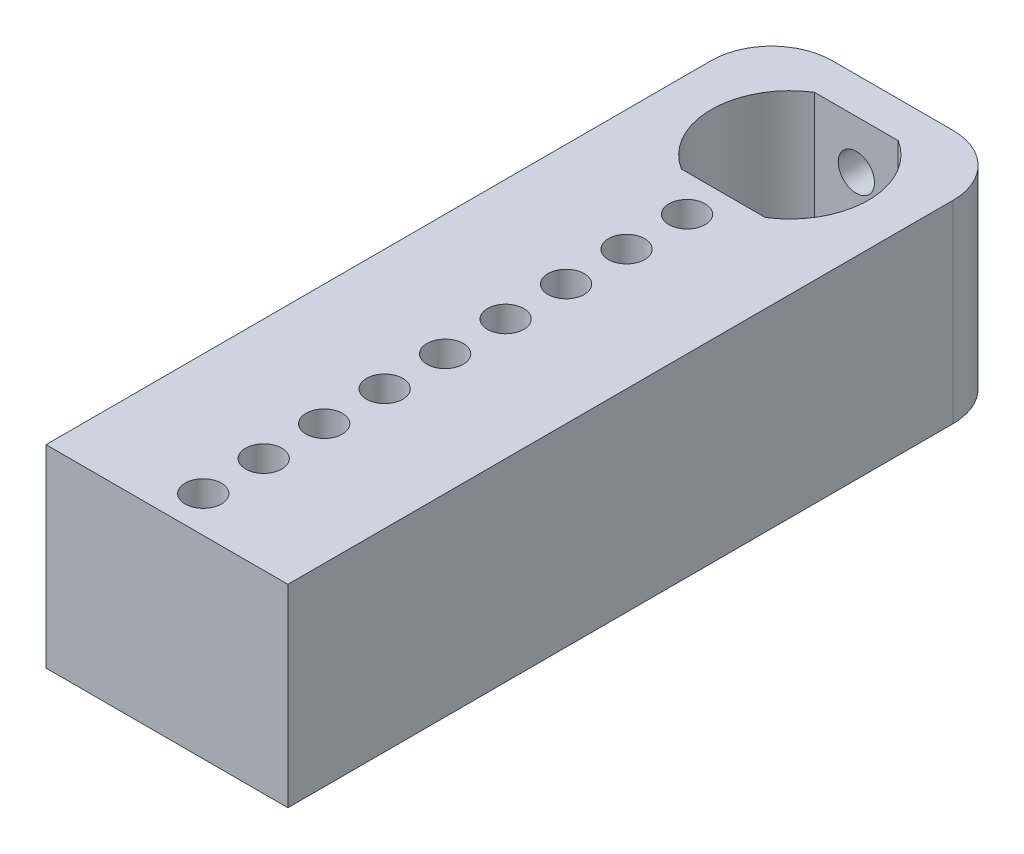
ISO-10303-21;
HEADER;
FILE_DESCRIPTION(('STEP AP214'),'2;1');
FILE_NAME('part.step','',(''),(''),'','','');
FILE_SCHEMA(('AUTOMOTIVE_DESIGN { 1 0 10303 214 1 1 1 1 }'));
ENDSEC;
DATA;
#1=APPLICATION_CONTEXT('core data for automotive mechanical design processes');
#2=APPLICATION_PROTOCOL_DEFINITION('international standard','automotive_design',2000,#1);
#3=PRODUCT_CONTEXT('',#1,'mechanical');
#4=PRODUCT('Part','Part','',(#3));
#5=PRODUCT_RELATED_PRODUCT_CATEGORY('part','',(#4));
#6=PRODUCT_DEFINITION_FORMATION('','',#4);
#7=PRODUCT_DEFINITION_CONTEXT('part definition',#1,'design');
#8=PRODUCT_DEFINITION('design','',#6,#7);
#9=PRODUCT_DEFINITION_SHAPE('','',#8);
#10=(LENGTH_UNIT() NAMED_UNIT(*) SI_UNIT(.MILLI.,.METRE.));
#11=(NAMED_UNIT(*) PLANE_ANGLE_UNIT() SI_UNIT($,.RADIAN.));
#12=(NAMED_UNIT(*) SI_UNIT($,.STERADIAN.) SOLID_ANGLE_UNIT());
#13=UNCERTAINTY_MEASURE_WITH_UNIT(LENGTH_MEASURE(1.E-05),#10,'distance_accuracy_value','');
#14=(GEOMETRIC_REPRESENTATION_CONTEXT(3) GLOBAL_UNCERTAINTY_ASSIGNED_CONTEXT((#13)) GLOBAL_UNIT_ASSIGNED_CONTEXT((#10,
#11,#12)) REPRESENTATION_CONTEXT('',''));
#15=CARTESIAN_POINT('',(0.,0.,0.));
#16=DIRECTION('',(0.,0.,1.));
#17=DIRECTION('',(1.,0.,0.));
#18=AXIS2_PLACEMENT_3D('',#15,#16,#17);
#19=CARTESIAN_POINT('',(10.,16.,30.));
#20=DIRECTION('',(-1.,0.,0.));
#21=DIRECTION('',(0.,0.,1.));
#22=AXIS2_PLACEMENT_3D('',#19,#20,#21);
#23=PLANE('',#22);
#24=DIRECTION('',(0.,0.,-1.));
#25=VECTOR('',#24,1.);
#26=CARTESIAN_POINT('',(10.,0.,30.));
#27=LINE('',#26,#25);
#28=CARTESIAN_POINT('',(10.,0.,30.));
#29=VERTEX_POINT('',#28);
#30=CARTESIAN_POINT('',(10.,0.,-25.));
#31=VERTEX_POINT('',#30);
#32=EDGE_CURVE('E160',#29,#31,#27,.T.);
#33=ORIENTED_EDGE('',*,*,#32,.T.);
#34=DIRECTION('',(0.,-1.,0.));
#35=VECTOR('',#34,1.);
#36=CARTESIAN_POINT('',(10.,16.,-25.));
#37=LINE('',#36,#35);
#38=CARTESIAN_POINT('',(10.,16.,-25.));
#39=VERTEX_POINT('',#38);
#40=EDGE_CURVE('E11',#31,#39,#37,.F.);
#41=ORIENTED_EDGE('',*,*,#40,.T.);
#42=DIRECTION('',(0.,0.,-1.));
#43=VECTOR('',#42,1.);
#44=CARTESIAN_POINT('',(10.,16.,30.));
#45=LINE('',#44,#43);
#46=CARTESIAN_POINT('',(10.,16.,30.));
#47=VERTEX_POINT('',#46);
#48=EDGE_CURVE('E164',#47,#39,#45,.T.);
#49=ORIENTED_EDGE('',*,*,#48,.F.);
#50=DIRECTION('',(0.,-1.,0.));
#51=VECTOR('',#50,1.);
#52=CARTESIAN_POINT('',(10.,16.,30.));
#53=LINE('',#52,#51);
#54=EDGE_CURVE('E173',#47,#29,#53,.T.);
#55=ORIENTED_EDGE('',*,*,#54,.T.);
#56=EDGE_LOOP('',(#33,#41,#49,#55));
#57=FACE_BOUND('',#56,.T.);
#58=ADVANCED_FACE('F37',(#57),#23,.F.);
#59=CARTESIAN_POINT('',(-10.,16.,-30.));
#60=DIRECTION('',(0.,0.,1.));
#61=DIRECTION('',(1.,0.,0.));
#62=AXIS2_PLACEMENT_3D('',#59,#60,#61);
#63=PLANE('',#62);
#64=CARTESIAN_POINT('',(0.,12.,-30.));
#65=DIRECTION('',(0.,0.,-1.));
#66=DIRECTION('',(-1.,0.,0.));
#67=AXIS2_PLACEMENT_3D('',#64,#65,#66);
#68=CIRCLE('',#67,1.5);
#69=CARTESIAN_POINT('',(-1.5,12.,-30.));
#70=VERTEX_POINT('',#69);
#71=EDGE_CURVE('E529',#70,#70,#68,.T.);
#72=ORIENTED_EDGE('',*,*,#71,.F.);
#73=EDGE_LOOP('',(#72));
#74=FACE_BOUND('',#73,.T.);
#75=CARTESIAN_POINT('',(0.,4.,-30.));
#76=DIRECTION('',(0.,0.,-1.));
#77=DIRECTION('',(-1.,0.,0.));
#78=AXIS2_PLACEMENT_3D('',#75,#76,#77);
#79=CIRCLE('',#78,1.5);
#80=CARTESIAN_POINT('',(-1.5,4.,-30.));
#81=VERTEX_POINT('',#80);
#82=EDGE_CURVE('E530',#81,#81,#79,.T.);
#83=ORIENTED_EDGE('',*,*,#82,.F.);
#84=EDGE_LOOP('',(#83));
#85=FACE_BOUND('',#84,.T.);
#86=DIRECTION('',(-1.,0.,0.));
#87=VECTOR('',#86,1.);
#88=CARTESIAN_POINT('',(-10.,0.,-30.));
#89=LINE('',#88,#87);
#90=CARTESIAN_POINT('',(5.,0.,-30.));
#91=VERTEX_POINT('',#90);
#92=CARTESIAN_POINT('',(-5.,0.,-30.));
#93=VERTEX_POINT('',#92);
#94=EDGE_CURVE('E175',#91,#93,#89,.T.);
#95=ORIENTED_EDGE('',*,*,#94,.T.);
#96=DIRECTION('',(0.,-1.,0.));
#97=VECTOR('',#96,1.);
#98=CARTESIAN_POINT('',(-5.,16.,-30.));
#99=LINE('',#98,#97);
#100=CARTESIAN_POINT('',(-5.,16.,-30.));
#101=VERTEX_POINT('',#100);
#102=EDGE_CURVE('E58',#93,#101,#99,.F.);
#103=ORIENTED_EDGE('',*,*,#102,.T.);
#104=DIRECTION('',(-1.,0.,0.));
#105=VECTOR('',#104,1.);
#106=CARTESIAN_POINT('',(-10.,16.,-30.));
#107=LINE('',#106,#105);
#108=CARTESIAN_POINT('',(5.,16.,-30.));
#109=VERTEX_POINT('',#108);
#110=EDGE_CURVE('E166',#109,#101,#107,.T.);
#111=ORIENTED_EDGE('',*,*,#110,.F.);
#112=DIRECTION('',(0.,-1.,0.));
#113=VECTOR('',#112,1.);
#114=CARTESIAN_POINT('',(5.,16.,-30.));
#115=LINE('',#114,#113);
#116=EDGE_CURVE('E192',#109,#91,#115,.T.);
#117=ORIENTED_EDGE('',*,*,#116,.T.);
#118=EDGE_LOOP('',(#95,#103,#111,#117));
#119=FACE_BOUND('',#118,.T.);
#120=ADVANCED_FACE('F211',(#74,#85,#119),#63,.F.);
#121=CARTESIAN_POINT('',(-10.,16.,30.));
#122=DIRECTION('',(1.,0.,0.));
#123=DIRECTION('',(0.,0.,-1.));
#124=AXIS2_PLACEMENT_3D('',#121,#122,#123);
#125=PLANE('',#124);
#126=DIRECTION('',(0.,0.,1.));
#127=VECTOR('',#126,1.);
#128=CARTESIAN_POINT('',(-10.,16.,30.));
#129=LINE('',#128,#127);
#130=CARTESIAN_POINT('',(-10.,16.,-25.));
#131=VERTEX_POINT('',#130);
#132=CARTESIAN_POINT('',(-10.,16.,30.));
#133=VERTEX_POINT('',#132);
#134=EDGE_CURVE('E169',#131,#133,#129,.T.);
#135=ORIENTED_EDGE('',*,*,#134,.F.);
#136=DIRECTION('',(0.,-1.,0.));
#137=VECTOR('',#136,1.);
#138=CARTESIAN_POINT('',(-10.,16.,-25.));
#139=LINE('',#138,#137);
#140=CARTESIAN_POINT('',(-10.,0.,-25.));
#141=VERTEX_POINT('',#140);
#142=EDGE_CURVE('E185',#131,#141,#139,.T.);
#143=ORIENTED_EDGE('',*,*,#142,.T.);
#144=DIRECTION('',(0.,0.,1.));
#145=VECTOR('',#144,1.);
#146=CARTESIAN_POINT('',(-10.,0.,30.));
#147=LINE('',#146,#145);
#148=CARTESIAN_POINT('',(-10.,0.,30.));
#149=VERTEX_POINT('',#148);
#150=EDGE_CURVE('E177',#141,#149,#147,.T.);
#151=ORIENTED_EDGE('',*,*,#150,.T.);
#152=DIRECTION('',(0.,-1.,0.));
#153=VECTOR('',#152,1.);
#154=CARTESIAN_POINT('',(-10.,16.,30.));
#155=LINE('',#154,#153);
#156=EDGE_CURVE('E182',#133,#149,#155,.T.);
#157=ORIENTED_EDGE('',*,*,#156,.F.);
#158=EDGE_LOOP('',(#135,#143,#151,#157));
#159=FACE_BOUND('',#158,.T.);
#160=ADVANCED_FACE('F205',(#159),#125,.F.);
#161=CARTESIAN_POINT('',(-10.,16.,30.));
#162=DIRECTION('',(0.,0.,-1.));
#163=DIRECTION('',(-1.,0.,0.));
#164=AXIS2_PLACEMENT_3D('',#161,#162,#163);
#165=PLANE('',#164);
#166=DIRECTION('',(1.,0.,0.));
#167=VECTOR('',#166,1.);
#168=CARTESIAN_POINT('',(-10.,0.,30.));
#169=LINE('',#168,#167);
#170=EDGE_CURVE('E167',#149,#29,#169,.T.);
#171=ORIENTED_EDGE('',*,*,#170,.T.);
#172=ORIENTED_EDGE('',*,*,#54,.F.);
#173=DIRECTION('',(1.,0.,0.));
#174=VECTOR('',#173,1.);
#175=CARTESIAN_POINT('',(-10.,16.,30.));
#176=LINE('',#175,#174);
#177=EDGE_CURVE('E171',#133,#47,#176,.T.);
#178=ORIENTED_EDGE('',*,*,#177,.F.);
#179=ORIENTED_EDGE('',*,*,#156,.T.);
#180=EDGE_LOOP('',(#171,#172,#178,#179));
#181=FACE_BOUND('',#180,.T.);
#182=ADVANCED_FACE('F218',(#181),#165,.F.);
#183=CARTESIAN_POINT('',(0.,16.,0.));
#184=DIRECTION('',(0.,-1.,0.));
#185=DIRECTION('',(0.,0.,-1.));
#186=AXIS2_PLACEMENT_3D('',#183,#184,#185);
#187=PLANE('',#186);
#188=CARTESIAN_POINT('',(-1.68816679534573E-13,16.,-13.));
#189=DIRECTION('',(0.,1.,0.));
#190=DIRECTION('',(0.,0.,1.));
#191=AXIS2_PLACEMENT_3D('',#188,#189,#190);
#192=CIRCLE('',#191,1.5);
#193=CARTESIAN_POINT('',(-1.68816679534573E-13,16.,-11.5));
#194=VERTEX_POINT('',#193);
#195=EDGE_CURVE('E537',#194,#194,#192,.T.);
#196=ORIENTED_EDGE('',*,*,#195,.F.);
#197=EDGE_LOOP('',(#196));
#198=FACE_BOUND('',#197,.T.);
#199=CARTESIAN_POINT('',(-1.16750621151713E-13,16.,-8.00000000000001));
#200=DIRECTION('',(0.,1.,0.));
#201=DIRECTION('',(0.,0.,1.));
#202=AXIS2_PLACEMENT_3D('',#199,#200,#201);
#203=CIRCLE('',#202,1.5);
#204=CARTESIAN_POINT('',(-1.16750621151713E-13,16.,-6.50000000000001));
#205=VERTEX_POINT('',#204);
#206=EDGE_CURVE('E583',#205,#205,#203,.T.);
#207=ORIENTED_EDGE('',*,*,#206,.F.);
#208=EDGE_LOOP('',(#207));
#209=FACE_BOUND('',#208,.T.);
#210=CARTESIAN_POINT('',(0.,16.,-3.00000000000001));
#211=DIRECTION('',(0.,1.,0.));
#212=DIRECTION('',(0.,0.,1.));
#213=AXIS2_PLACEMENT_3D('',#210,#211,#212);
#214=CIRCLE('',#213,1.5);
#215=CARTESIAN_POINT('',(0.,16.,-1.50000000000001));
#216=VERTEX_POINT('',#215);
#217=EDGE_CURVE('E577',#216,#216,#214,.T.);
#218=ORIENTED_EDGE('',*,*,#217,.F.);
#219=EDGE_LOOP('',(#218));
#220=FACE_BOUND('',#219,.T.);
#221=CARTESIAN_POINT('',(0.,16.,1.99999999999999));
#222=DIRECTION('',(0.,1.,0.));
#223=DIRECTION('',(0.,0.,1.));
#224=AXIS2_PLACEMENT_3D('',#221,#222,#223);
#225=CIRCLE('',#224,1.5);
#226=CARTESIAN_POINT('',(0.,16.,3.49999999999999));
#227=VERTEX_POINT('',#226);
#228=EDGE_CURVE('E571',#227,#227,#225,.T.);
#229=ORIENTED_EDGE('',*,*,#228,.F.);
#230=EDGE_LOOP('',(#229));
#231=FACE_BOUND('',#230,.T.);
#232=CARTESIAN_POINT('',(0.,16.,6.99999999999999));
#233=DIRECTION('',(0.,1.,0.));
#234=DIRECTION('',(0.,0.,1.));
#235=AXIS2_PLACEMENT_3D('',#232,#233,#234);
#236=CIRCLE('',#235,1.5);
#237=CARTESIAN_POINT('',(0.,16.,8.49999999999999));
#238=VERTEX_POINT('',#237);
#239=EDGE_CURVE('E565',#238,#238,#236,.T.);
#240=ORIENTED_EDGE('',*,*,#239,.F.);
#241=EDGE_LOOP('',(#240));
#242=FACE_BOUND('',#241,.T.);
#243=CARTESIAN_POINT('',(0.,16.,12.));
#244=DIRECTION('',(0.,1.,0.));
#245=DIRECTION('',(0.,0.,1.));
#246=AXIS2_PLACEMENT_3D('',#243,#244,#245);
#247=CIRCLE('',#246,1.5);
#248=CARTESIAN_POINT('',(0.,16.,13.5));
#249=VERTEX_POINT('',#248);
#250=EDGE_CURVE('E559',#249,#249,#247,.T.);
#251=ORIENTED_EDGE('',*,*,#250,.F.);
#252=EDGE_LOOP('',(#251));
#253=FACE_BOUND('',#252,.T.);
#254=CARTESIAN_POINT('',(1.43579670762588E-13,16.,17.));
#255=DIRECTION('',(0.,1.,0.));
#256=DIRECTION('',(0.,0.,1.));
#257=AXIS2_PLACEMENT_3D('',#254,#255,#256);
#258=CIRCLE('',#257,1.5);
#259=CARTESIAN_POINT('',(1.43579670762588E-13,16.,18.5));
#260=VERTEX_POINT('',#259);
#261=EDGE_CURVE('E553',#260,#260,#258,.T.);
#262=ORIENTED_EDGE('',*,*,#261,.F.);
#263=EDGE_LOOP('',(#262));
#264=FACE_BOUND('',#263,.T.);
#265=CARTESIAN_POINT('',(1.95645729145448E-13,16.,22.));
#266=DIRECTION('',(0.,1.,0.));
#267=DIRECTION('',(0.,0.,1.));
#268=AXIS2_PLACEMENT_3D('',#265,#266,#267);
#269=CIRCLE('',#268,1.5);
#270=CARTESIAN_POINT('',(1.95645729145448E-13,16.,23.5));
#271=VERTEX_POINT('',#270);
#272=EDGE_CURVE('E547',#271,#271,#269,.T.);
#273=ORIENTED_EDGE('',*,*,#272,.F.);
#274=EDGE_LOOP('',(#273));
#275=FACE_BOUND('',#274,.T.);
#276=CARTESIAN_POINT('',(2.47711787528309E-13,16.,27.));
#277=DIRECTION('',(0.,1.,0.));
#278=DIRECTION('',(0.,0.,1.));
#279=AXIS2_PLACEMENT_3D('',#276,#277,#278);
#280=CIRCLE('',#279,1.5);
#281=CARTESIAN_POINT('',(2.47711787528309E-13,16.,28.5));
#282=VERTEX_POINT('',#281);
#283=EDGE_CURVE('E541',#282,#282,#280,.T.);
#284=ORIENTED_EDGE('',*,*,#283,.F.);
#285=EDGE_LOOP('',(#284));
#286=FACE_BOUND('',#285,.T.);
#287=DIRECTION('',(1.,0.,0.));
#288=VECTOR('',#287,1.);
#289=CARTESIAN_POINT('',(-3.46410161513776,16.,-16.));
#290=LINE('',#289,#288);
#291=CARTESIAN_POINT('',(-3.46410161513776,16.,-16.));
#292=VERTEX_POINT('',#291);
#293=CARTESIAN_POINT('',(3.46410161513776,16.,-16.));
#294=VERTEX_POINT('',#293);
#295=EDGE_CURVE('E153',#292,#294,#290,.T.);
#296=ORIENTED_EDGE('',*,*,#295,.F.);
#297=CARTESIAN_POINT('',(0.,16.,-21.5));
#298=DIRECTION('',(0.,1.,0.));
#299=DIRECTION('',(0.,0.,1.));
#300=AXIS2_PLACEMENT_3D('',#297,#298,#299);
#301=CIRCLE('',#300,6.5);
#302=CARTESIAN_POINT('',(-3.46410161513776,16.,-27.));
#303=VERTEX_POINT('',#302);
#304=EDGE_CURVE('E123',#303,#292,#301,.T.);
#305=ORIENTED_EDGE('',*,*,#304,.F.);
#306=DIRECTION('',(-1.,0.,0.));
#307=VECTOR('',#306,1.);
#308=CARTESIAN_POINT('',(-3.46410161513776,16.,-27.));
#309=LINE('',#308,#307);
#310=CARTESIAN_POINT('',(3.46410161513776,16.,-27.));
#311=VERTEX_POINT('',#310);
#312=EDGE_CURVE('E141',#311,#303,#309,.T.);
#313=ORIENTED_EDGE('',*,*,#312,.F.);
#314=CARTESIAN_POINT('',(0.,16.,-21.5));
#315=DIRECTION('',(0.,1.,0.));
#316=DIRECTION('',(0.,0.,1.));
#317=AXIS2_PLACEMENT_3D('',#314,#315,#316);
#318=CIRCLE('',#317,6.5);
#319=EDGE_CURVE('E144',#294,#311,#318,.T.);
#320=ORIENTED_EDGE('',*,*,#319,.F.);
#321=EDGE_LOOP('',(#296,#305,#313,#320));
#322=FACE_BOUND('',#321,.T.);
#323=ORIENTED_EDGE('',*,*,#110,.T.);
#324=CARTESIAN_POINT('',(-5.,16.,-25.));
#325=DIRECTION('',(0.,-1.,0.));
#326=DIRECTION('',(0.,0.,-1.));
#327=AXIS2_PLACEMENT_3D('',#324,#325,#326);
#328=CIRCLE('',#327,5.);
#329=EDGE_CURVE('E45',#101,#131,#328,.F.);
#330=ORIENTED_EDGE('',*,*,#329,.T.);
#331=ORIENTED_EDGE('',*,*,#134,.T.);
#332=ORIENTED_EDGE('',*,*,#177,.T.);
#333=ORIENTED_EDGE('',*,*,#48,.T.);
#334=CARTESIAN_POINT('',(5.,16.,-25.));
#335=DIRECTION('',(0.,-1.,0.));
#336=DIRECTION('',(0.,0.,-1.));
#337=AXIS2_PLACEMENT_3D('',#334,#335,#336);
#338=CIRCLE('',#337,5.);
#339=EDGE_CURVE('E196',#39,#109,#338,.F.);
#340=ORIENTED_EDGE('',*,*,#339,.T.);
#341=EDGE_LOOP('',(#323,#330,#331,#332,#333,#340));
#342=FACE_BOUND('',#341,.T.);
#343=ADVANCED_FACE('F200',(#198,#209,#220,#231,#242,#253,#264,#275,#286,#322,#342),#187,.F.);
#344=CARTESIAN_POINT('',(0.,0.,0.));
#345=DIRECTION('',(0.,-1.,0.));
#346=DIRECTION('',(0.,0.,-1.));
#347=AXIS2_PLACEMENT_3D('',#344,#345,#346);
#348=PLANE('',#347);
#349=CARTESIAN_POINT('',(0.,0.,-21.5));
#350=DIRECTION('',(0.,1.,0.));
#351=DIRECTION('',(0.,0.,1.));
#352=AXIS2_PLACEMENT_3D('',#349,#350,#351);
#353=CIRCLE('',#352,6.5);
#354=CARTESIAN_POINT('',(-3.46410161513776,0.,-27.));
#355=VERTEX_POINT('',#354);
#356=CARTESIAN_POINT('',(-3.46410161513776,0.,-16.));
#357=VERTEX_POINT('',#356);
#358=EDGE_CURVE('E120',#355,#357,#353,.T.);
#359=ORIENTED_EDGE('',*,*,#358,.T.);
#360=DIRECTION('',(1.,0.,0.));
#361=VECTOR('',#360,1.);
#362=CARTESIAN_POINT('',(-3.46410161513776,0.,-16.));
#363=LINE('',#362,#361);
#364=CARTESIAN_POINT('',(3.46410161513776,0.,-16.));
#365=VERTEX_POINT('',#364);
#366=EDGE_CURVE('E132',#357,#365,#363,.T.);
#367=ORIENTED_EDGE('',*,*,#366,.T.);
#368=CARTESIAN_POINT('',(0.,0.,-21.5));
#369=DIRECTION('',(0.,1.,0.));
#370=DIRECTION('',(0.,0.,1.));
#371=AXIS2_PLACEMENT_3D('',#368,#369,#370);
#372=CIRCLE('',#371,6.5);
#373=CARTESIAN_POINT('',(3.46410161513776,0.,-27.));
#374=VERTEX_POINT('',#373);
#375=EDGE_CURVE('E136',#365,#374,#372,.T.);
#376=ORIENTED_EDGE('',*,*,#375,.T.);
#377=DIRECTION('',(-1.,0.,0.));
#378=VECTOR('',#377,1.);
#379=CARTESIAN_POINT('',(-3.46410161513776,0.,-27.));
#380=LINE('',#379,#378);
#381=EDGE_CURVE('E128',#374,#355,#380,.T.);
#382=ORIENTED_EDGE('',*,*,#381,.T.);
#383=EDGE_LOOP('',(#359,#367,#376,#382));
#384=FACE_BOUND('',#383,.T.);
#385=ORIENTED_EDGE('',*,*,#150,.F.);
#386=CARTESIAN_POINT('',(-5.,0.,-25.));
#387=DIRECTION('',(0.,-1.,0.));
#388=DIRECTION('',(0.,0.,-1.));
#389=AXIS2_PLACEMENT_3D('',#386,#387,#388);
#390=CIRCLE('',#389,5.);
#391=EDGE_CURVE('E190',#141,#93,#390,.T.);
#392=ORIENTED_EDGE('',*,*,#391,.T.);
#393=ORIENTED_EDGE('',*,*,#94,.F.);
#394=CARTESIAN_POINT('',(5.,0.,-25.));
#395=DIRECTION('',(0.,-1.,0.));
#396=DIRECTION('',(0.,0.,-1.));
#397=AXIS2_PLACEMENT_3D('',#394,#395,#396);
#398=CIRCLE('',#397,5.);
#399=EDGE_CURVE('E188',#91,#31,#398,.T.);
#400=ORIENTED_EDGE('',*,*,#399,.T.);
#401=ORIENTED_EDGE('',*,*,#32,.F.);
#402=ORIENTED_EDGE('',*,*,#170,.F.);
#403=EDGE_LOOP('',(#385,#392,#393,#400,#401,#402));
#404=FACE_BOUND('',#403,.T.);
#405=ADVANCED_FACE('F138',(#384,#404),#348,.T.);
#406=CARTESIAN_POINT('',(0.,0.,-21.5));
#407=DIRECTION('',(0.,1.,0.));
#408=DIRECTION('',(0.,0.,1.));
#409=AXIS2_PLACEMENT_3D('',#406,#407,#408);
#410=CYLINDRICAL_SURFACE('',#409,6.5);
#411=ORIENTED_EDGE('',*,*,#304,.T.);
#412=DIRECTION('',(0.,1.,0.));
#413=VECTOR('',#412,1.);
#414=CARTESIAN_POINT('',(-3.46410161513776,0.,-16.));
#415=LINE('',#414,#413);
#416=EDGE_CURVE('E116',#357,#292,#415,.T.);
#417=ORIENTED_EDGE('',*,*,#416,.F.);
#418=ORIENTED_EDGE('',*,*,#358,.F.);
#419=DIRECTION('',(0.,1.,0.));
#420=VECTOR('',#419,1.);
#421=CARTESIAN_POINT('',(-3.46410161513776,0.,-27.));
#422=LINE('',#421,#420);
#423=EDGE_CURVE('E158',#355,#303,#422,.T.);
#424=ORIENTED_EDGE('',*,*,#423,.T.);
#425=EDGE_LOOP('',(#411,#417,#418,#424));
#426=FACE_BOUND('',#425,.T.);
#427=ADVANCED_FACE('F118',(#426),#410,.F.);
#428=CARTESIAN_POINT('',(-3.46410161513776,0.,-27.));
#429=DIRECTION('',(0.,0.,-1.));
#430=DIRECTION('',(-1.,0.,0.));
#431=AXIS2_PLACEMENT_3D('',#428,#429,#430);
#432=PLANE('',#431);
#433=CARTESIAN_POINT('',(0.,12.,-27.));
#434=DIRECTION('',(0.,0.,-1.));
#435=DIRECTION('',(-1.,0.,0.));
#436=AXIS2_PLACEMENT_3D('',#433,#434,#435);
#437=CIRCLE('',#436,1.5);
#438=CARTESIAN_POINT('',(-1.5,12.,-27.));
#439=VERTEX_POINT('',#438);
#440=EDGE_CURVE('E154',#439,#439,#437,.F.);
#441=ORIENTED_EDGE('',*,*,#440,.F.);
#442=EDGE_LOOP('',(#441));
#443=FACE_BOUND('',#442,.T.);
#444=CARTESIAN_POINT('',(0.,4.,-27.));
#445=DIRECTION('',(0.,0.,-1.));
#446=DIRECTION('',(-1.,0.,0.));
#447=AXIS2_PLACEMENT_3D('',#444,#445,#446);
#448=CIRCLE('',#447,1.5);
#449=CARTESIAN_POINT('',(-1.5,4.,-27.));
#450=VERTEX_POINT('',#449);
#451=EDGE_CURVE('E147',#450,#450,#448,.F.);
#452=ORIENTED_EDGE('',*,*,#451,.F.);
#453=EDGE_LOOP('',(#452));
#454=FACE_BOUND('',#453,.T.);
#455=ORIENTED_EDGE('',*,*,#312,.T.);
#456=ORIENTED_EDGE('',*,*,#423,.F.);
#457=ORIENTED_EDGE('',*,*,#381,.F.);
#458=DIRECTION('',(0.,1.,0.));
#459=VECTOR('',#458,1.);
#460=CARTESIAN_POINT('',(3.46410161513776,0.,-27.));
#461=LINE('',#460,#459);
#462=EDGE_CURVE('E161',#374,#311,#461,.T.);
#463=ORIENTED_EDGE('',*,*,#462,.T.);
#464=EDGE_LOOP('',(#455,#456,#457,#463));
#465=FACE_BOUND('',#464,.T.);
#466=ADVANCED_FACE('F324',(#443,#454,#465),#432,.F.);
#467=CARTESIAN_POINT('',(0.,0.,-21.5));
#468=DIRECTION('',(0.,1.,0.));
#469=DIRECTION('',(0.,0.,1.));
#470=AXIS2_PLACEMENT_3D('',#467,#468,#469);
#471=CYLINDRICAL_SURFACE('',#470,6.5);
#472=ORIENTED_EDGE('',*,*,#319,.T.);
#473=ORIENTED_EDGE('',*,*,#462,.F.);
#474=ORIENTED_EDGE('',*,*,#375,.F.);
#475=DIRECTION('',(0.,1.,0.));
#476=VECTOR('',#475,1.);
#477=CARTESIAN_POINT('',(3.46410161513776,0.,-16.));
#478=LINE('',#477,#476);
#479=EDGE_CURVE('E127',#365,#294,#478,.T.);
#480=ORIENTED_EDGE('',*,*,#479,.T.);
#481=EDGE_LOOP('',(#472,#473,#474,#480));
#482=FACE_BOUND('',#481,.T.);
#483=ADVANCED_FACE('F327',(#482),#471,.F.);
#484=CARTESIAN_POINT('',(-3.46410161513776,0.,-16.));
#485=DIRECTION('',(0.,0.,1.));
#486=DIRECTION('',(1.,0.,0.));
#487=AXIS2_PLACEMENT_3D('',#484,#485,#486);
#488=PLANE('',#487);
#489=ORIENTED_EDGE('',*,*,#295,.T.);
#490=ORIENTED_EDGE('',*,*,#479,.F.);
#491=ORIENTED_EDGE('',*,*,#366,.F.);
#492=ORIENTED_EDGE('',*,*,#416,.T.);
#493=EDGE_LOOP('',(#489,#490,#491,#492));
#494=FACE_BOUND('',#493,.T.);
#495=ADVANCED_FACE('F133',(#494),#488,.F.);
#496=CARTESIAN_POINT('',(0.,4.,-22.7573593128807));
#497=DIRECTION('',(0.,0.,-1.));
#498=DIRECTION('',(-1.,0.,0.));
#499=AXIS2_PLACEMENT_3D('',#496,#497,#498);
#500=CYLINDRICAL_SURFACE('',#499,1.5);
#501=ORIENTED_EDGE('',*,*,#451,.T.);
#502=EDGE_LOOP('',(#501));
#503=FACE_BOUND('',#502,.T.);
#504=ORIENTED_EDGE('',*,*,#82,.T.);
#505=EDGE_LOOP('',(#504));
#506=FACE_BOUND('',#505,.T.);
#507=ADVANCED_FACE('F319',(#503,#506),#500,.F.);
#508=CARTESIAN_POINT('',(0.,12.,-22.7573593128807));
#509=DIRECTION('',(0.,0.,-1.));
#510=DIRECTION('',(-1.,0.,0.));
#511=AXIS2_PLACEMENT_3D('',#508,#509,#510);
#512=CYLINDRICAL_SURFACE('',#511,1.5);
#513=ORIENTED_EDGE('',*,*,#440,.T.);
#514=EDGE_LOOP('',(#513));
#515=FACE_BOUND('',#514,.T.);
#516=ORIENTED_EDGE('',*,*,#71,.T.);
#517=EDGE_LOOP('',(#516));
#518=FACE_BOUND('',#517,.T.);
#519=ADVANCED_FACE('F315',(#515,#518),#512,.F.);
#520=CARTESIAN_POINT('',(2.47711787528309E-13,8.,27.));
#521=DIRECTION('',(0.,1.,0.));
#522=DIRECTION('',(0.,0.,1.));
#523=AXIS2_PLACEMENT_3D('',#520,#521,#522);
#524=CYLINDRICAL_SURFACE('',#523,1.5);
#525=CARTESIAN_POINT('',(2.47711787528309E-13,8.,27.));
#526=DIRECTION('',(0.,1.,0.));
#527=DIRECTION('',(0.,0.,1.));
#528=AXIS2_PLACEMENT_3D('',#525,#526,#527);
#529=CIRCLE('',#528,1.5);
#530=CARTESIAN_POINT('',(2.47711787528309E-13,8.,28.5));
#531=VERTEX_POINT('',#530);
#532=EDGE_CURVE('E544',#531,#531,#529,.T.);
#533=ORIENTED_EDGE('',*,*,#532,.F.);
#534=EDGE_LOOP('',(#533));
#535=FACE_BOUND('',#534,.T.);
#536=ORIENTED_EDGE('',*,*,#283,.T.);
#537=EDGE_LOOP('',(#536));
#538=FACE_BOUND('',#537,.T.);
#539=ADVANCED_FACE('F311',(#535,#538),#524,.F.);
#540=CARTESIAN_POINT('',(2.47711787528309E-13,8.,27.));
#541=DIRECTION('',(0.,1.,0.));
#542=DIRECTION('',(0.,0.,1.));
#543=AXIS2_PLACEMENT_3D('',#540,#541,#542);
#544=PLANE('',#543);
#545=ORIENTED_EDGE('',*,*,#532,.T.);
#546=EDGE_LOOP('',(#545));
#547=FACE_BOUND('',#546,.T.);
#548=ADVANCED_FACE('F307',(#547),#544,.T.);
#549=CARTESIAN_POINT('',(1.95645729145448E-13,8.,22.));
#550=DIRECTION('',(0.,1.,0.));
#551=DIRECTION('',(0.,0.,1.));
#552=AXIS2_PLACEMENT_3D('',#549,#550,#551);
#553=CYLINDRICAL_SURFACE('',#552,1.5);
#554=CARTESIAN_POINT('',(1.95645729145448E-13,8.,22.));
#555=DIRECTION('',(0.,1.,0.));
#556=DIRECTION('',(0.,0.,1.));
#557=AXIS2_PLACEMENT_3D('',#554,#555,#556);
#558=CIRCLE('',#557,1.5);
#559=CARTESIAN_POINT('',(1.95645729145448E-13,8.,23.5));
#560=VERTEX_POINT('',#559);
#561=EDGE_CURVE('E550',#560,#560,#558,.T.);
#562=ORIENTED_EDGE('',*,*,#561,.F.);
#563=EDGE_LOOP('',(#562));
#564=FACE_BOUND('',#563,.T.);
#565=ORIENTED_EDGE('',*,*,#272,.T.);
#566=EDGE_LOOP('',(#565));
#567=FACE_BOUND('',#566,.T.);
#568=ADVANCED_FACE('F303',(#564,#567),#553,.F.);
#569=CARTESIAN_POINT('',(1.95645729145448E-13,8.,22.));
#570=DIRECTION('',(0.,1.,0.));
#571=DIRECTION('',(0.,0.,1.));
#572=AXIS2_PLACEMENT_3D('',#569,#570,#571);
#573=PLANE('',#572);
#574=ORIENTED_EDGE('',*,*,#561,.T.);
#575=EDGE_LOOP('',(#574));
#576=FACE_BOUND('',#575,.T.);
#577=ADVANCED_FACE('F299',(#576),#573,.T.);
#578=CARTESIAN_POINT('',(1.43579670762588E-13,8.,17.));
#579=DIRECTION('',(0.,1.,0.));
#580=DIRECTION('',(0.,0.,1.));
#581=AXIS2_PLACEMENT_3D('',#578,#579,#580);
#582=CYLINDRICAL_SURFACE('',#581,1.5);
#583=CARTESIAN_POINT('',(1.43579670762588E-13,8.,17.));
#584=DIRECTION('',(0.,1.,0.));
#585=DIRECTION('',(0.,0.,1.));
#586=AXIS2_PLACEMENT_3D('',#583,#584,#585);
#587=CIRCLE('',#586,1.5);
#588=CARTESIAN_POINT('',(1.43579670762588E-13,8.,18.5));
#589=VERTEX_POINT('',#588);
#590=EDGE_CURVE('E556',#589,#589,#587,.T.);
#591=ORIENTED_EDGE('',*,*,#590,.F.);
#592=EDGE_LOOP('',(#591));
#593=FACE_BOUND('',#592,.T.);
#594=ORIENTED_EDGE('',*,*,#261,.T.);
#595=EDGE_LOOP('',(#594));
#596=FACE_BOUND('',#595,.T.);
#597=ADVANCED_FACE('F295',(#593,#596),#582,.F.);
#598=CARTESIAN_POINT('',(1.43579670762588E-13,8.,17.));
#599=DIRECTION('',(0.,1.,0.));
#600=DIRECTION('',(0.,0.,1.));
#601=AXIS2_PLACEMENT_3D('',#598,#599,#600);
#602=PLANE('',#601);
#603=ORIENTED_EDGE('',*,*,#590,.T.);
#604=EDGE_LOOP('',(#603));
#605=FACE_BOUND('',#604,.T.);
#606=ADVANCED_FACE('F291',(#605),#602,.T.);
#607=CARTESIAN_POINT('',(0.,8.,12.));
#608=DIRECTION('',(0.,1.,0.));
#609=DIRECTION('',(0.,0.,1.));
#610=AXIS2_PLACEMENT_3D('',#607,#608,#609);
#611=CYLINDRICAL_SURFACE('',#610,1.5);
#612=CARTESIAN_POINT('',(0.,8.,12.));
#613=DIRECTION('',(0.,1.,0.));
#614=DIRECTION('',(0.,0.,1.));
#615=AXIS2_PLACEMENT_3D('',#612,#613,#614);
#616=CIRCLE('',#615,1.5);
#617=CARTESIAN_POINT('',(0.,8.,13.5));
#618=VERTEX_POINT('',#617);
#619=EDGE_CURVE('E562',#618,#618,#616,.T.);
#620=ORIENTED_EDGE('',*,*,#619,.F.);
#621=EDGE_LOOP('',(#620));
#622=FACE_BOUND('',#621,.T.);
#623=ORIENTED_EDGE('',*,*,#250,.T.);
#624=EDGE_LOOP('',(#623));
#625=FACE_BOUND('',#624,.T.);
#626=ADVANCED_FACE('F287',(#622,#625),#611,.F.);
#627=CARTESIAN_POINT('',(0.,8.,12.));
#628=DIRECTION('',(0.,1.,0.));
#629=DIRECTION('',(0.,0.,1.));
#630=AXIS2_PLACEMENT_3D('',#627,#628,#629);
#631=PLANE('',#630);
#632=ORIENTED_EDGE('',*,*,#619,.T.);
#633=EDGE_LOOP('',(#632));
#634=FACE_BOUND('',#633,.T.);
#635=ADVANCED_FACE('F283',(#634),#631,.T.);
#636=CARTESIAN_POINT('',(0.,8.,6.99999999999999));
#637=DIRECTION('',(0.,1.,0.));
#638=DIRECTION('',(0.,0.,1.));
#639=AXIS2_PLACEMENT_3D('',#636,#637,#638);
#640=CYLINDRICAL_SURFACE('',#639,1.5);
#641=CARTESIAN_POINT('',(0.,8.,6.99999999999999));
#642=DIRECTION('',(0.,1.,0.));
#643=DIRECTION('',(0.,0.,1.));
#644=AXIS2_PLACEMENT_3D('',#641,#642,#643);
#645=CIRCLE('',#644,1.5);
#646=CARTESIAN_POINT('',(0.,8.,8.49999999999999));
#647=VERTEX_POINT('',#646);
#648=EDGE_CURVE('E568',#647,#647,#645,.T.);
#649=ORIENTED_EDGE('',*,*,#648,.F.);
#650=EDGE_LOOP('',(#649));
#651=FACE_BOUND('',#650,.T.);
#652=ORIENTED_EDGE('',*,*,#239,.T.);
#653=EDGE_LOOP('',(#652));
#654=FACE_BOUND('',#653,.T.);
#655=ADVANCED_FACE('F279',(#651,#654),#640,.F.);
#656=CARTESIAN_POINT('',(0.,8.,6.99999999999999));
#657=DIRECTION('',(0.,1.,0.));
#658=DIRECTION('',(0.,0.,1.));
#659=AXIS2_PLACEMENT_3D('',#656,#657,#658);
#660=PLANE('',#659);
#661=ORIENTED_EDGE('',*,*,#648,.T.);
#662=EDGE_LOOP('',(#661));
#663=FACE_BOUND('',#662,.T.);
#664=ADVANCED_FACE('F275',(#663),#660,.T.);
#665=CARTESIAN_POINT('',(0.,8.,1.99999999999999));
#666=DIRECTION('',(0.,1.,0.));
#667=DIRECTION('',(0.,0.,1.));
#668=AXIS2_PLACEMENT_3D('',#665,#666,#667);
#669=CYLINDRICAL_SURFACE('',#668,1.5);
#670=CARTESIAN_POINT('',(0.,8.,1.99999999999999));
#671=DIRECTION('',(0.,1.,0.));
#672=DIRECTION('',(0.,0.,1.));
#673=AXIS2_PLACEMENT_3D('',#670,#671,#672);
#674=CIRCLE('',#673,1.5);
#675=CARTESIAN_POINT('',(0.,8.,3.49999999999999));
#676=VERTEX_POINT('',#675);
#677=EDGE_CURVE('E574',#676,#676,#674,.T.);
#678=ORIENTED_EDGE('',*,*,#677,.F.);
#679=EDGE_LOOP('',(#678));
#680=FACE_BOUND('',#679,.T.);
#681=ORIENTED_EDGE('',*,*,#228,.T.);
#682=EDGE_LOOP('',(#681));
#683=FACE_BOUND('',#682,.T.);
#684=ADVANCED_FACE('F271',(#680,#683),#669,.F.);
#685=CARTESIAN_POINT('',(0.,8.,1.99999999999999));
#686=DIRECTION('',(0.,1.,0.));
#687=DIRECTION('',(0.,0.,1.));
#688=AXIS2_PLACEMENT_3D('',#685,#686,#687);
#689=PLANE('',#688);
#690=ORIENTED_EDGE('',*,*,#677,.T.);
#691=EDGE_LOOP('',(#690));
#692=FACE_BOUND('',#691,.T.);
#693=ADVANCED_FACE('F267',(#692),#689,.T.);
#694=CARTESIAN_POINT('',(0.,8.,-3.00000000000001));
#695=DIRECTION('',(0.,1.,0.));
#696=DIRECTION('',(0.,0.,1.));
#697=AXIS2_PLACEMENT_3D('',#694,#695,#696);
#698=CYLINDRICAL_SURFACE('',#697,1.5);
#699=CARTESIAN_POINT('',(0.,8.,-3.00000000000001));
#700=DIRECTION('',(0.,1.,0.));
#701=DIRECTION('',(0.,0.,1.));
#702=AXIS2_PLACEMENT_3D('',#699,#700,#701);
#703=CIRCLE('',#702,1.5);
#704=CARTESIAN_POINT('',(0.,8.,-1.50000000000001));
#705=VERTEX_POINT('',#704);
#706=EDGE_CURVE('E580',#705,#705,#703,.T.);
#707=ORIENTED_EDGE('',*,*,#706,.F.);
#708=EDGE_LOOP('',(#707));
#709=FACE_BOUND('',#708,.T.);
#710=ORIENTED_EDGE('',*,*,#217,.T.);
#711=EDGE_LOOP('',(#710));
#712=FACE_BOUND('',#711,.T.);
#713=ADVANCED_FACE('F263',(#709,#712),#698,.F.);
#714=CARTESIAN_POINT('',(0.,8.,-3.00000000000001));
#715=DIRECTION('',(0.,1.,0.));
#716=DIRECTION('',(0.,0.,1.));
#717=AXIS2_PLACEMENT_3D('',#714,#715,#716);
#718=PLANE('',#717);
#719=ORIENTED_EDGE('',*,*,#706,.T.);
#720=EDGE_LOOP('',(#719));
#721=FACE_BOUND('',#720,.T.);
#722=ADVANCED_FACE('F259',(#721),#718,.T.);
#723=CARTESIAN_POINT('',(-1.16750621151713E-13,8.,-8.00000000000001));
#724=DIRECTION('',(0.,1.,0.));
#725=DIRECTION('',(0.,0.,1.));
#726=AXIS2_PLACEMENT_3D('',#723,#724,#725);
#727=CYLINDRICAL_SURFACE('',#726,1.5);
#728=CARTESIAN_POINT('',(-1.16750621151713E-13,8.,-8.00000000000001));
#729=DIRECTION('',(0.,1.,0.));
#730=DIRECTION('',(0.,0.,1.));
#731=AXIS2_PLACEMENT_3D('',#728,#729,#730);
#732=CIRCLE('',#731,1.5);
#733=CARTESIAN_POINT('',(-1.16750621151713E-13,8.,-6.50000000000001));
#734=VERTEX_POINT('',#733);
#735=EDGE_CURVE('E586',#734,#734,#732,.T.);
#736=ORIENTED_EDGE('',*,*,#735,.F.);
#737=EDGE_LOOP('',(#736));
#738=FACE_BOUND('',#737,.T.);
#739=ORIENTED_EDGE('',*,*,#206,.T.);
#740=EDGE_LOOP('',(#739));
#741=FACE_BOUND('',#740,.T.);
#742=ADVANCED_FACE('F255',(#738,#741),#727,.F.);
#743=CARTESIAN_POINT('',(-1.16750621151713E-13,8.,-8.00000000000001));
#744=DIRECTION('',(0.,1.,0.));
#745=DIRECTION('',(0.,0.,1.));
#746=AXIS2_PLACEMENT_3D('',#743,#744,#745);
#747=PLANE('',#746);
#748=ORIENTED_EDGE('',*,*,#735,.T.);
#749=EDGE_LOOP('',(#748));
#750=FACE_BOUND('',#749,.T.);
#751=ADVANCED_FACE('F248',(#750),#747,.T.);
#752=CARTESIAN_POINT('',(-1.68816679534573E-13,8.,-13.));
#753=DIRECTION('',(0.,1.,0.));
#754=DIRECTION('',(0.,0.,1.));
#755=AXIS2_PLACEMENT_3D('',#752,#753,#754);
#756=CYLINDRICAL_SURFACE('',#755,1.5);
#757=CARTESIAN_POINT('',(-1.68816679534573E-13,8.,-13.));
#758=DIRECTION('',(0.,1.,0.));
#759=DIRECTION('',(0.,0.,1.));
#760=AXIS2_PLACEMENT_3D('',#757,#758,#759);
#761=CIRCLE('',#760,1.5);
#762=CARTESIAN_POINT('',(-1.68816679534573E-13,8.,-11.5));
#763=VERTEX_POINT('',#762);
#764=EDGE_CURVE('E534',#763,#763,#761,.T.);
#765=ORIENTED_EDGE('',*,*,#764,.F.);
#766=EDGE_LOOP('',(#765));
#767=FACE_BOUND('',#766,.T.);
#768=ORIENTED_EDGE('',*,*,#195,.T.);
#769=EDGE_LOOP('',(#768));
#770=FACE_BOUND('',#769,.T.);
#771=ADVANCED_FACE('F242',(#767,#770),#756,.F.);
#772=CARTESIAN_POINT('',(-1.68816679534573E-13,8.,-13.));
#773=DIRECTION('',(0.,1.,0.));
#774=DIRECTION('',(0.,0.,1.));
#775=AXIS2_PLACEMENT_3D('',#772,#773,#774);
#776=PLANE('',#775);
#777=ORIENTED_EDGE('',*,*,#764,.T.);
#778=EDGE_LOOP('',(#777));
#779=FACE_BOUND('',#778,.T.);
#780=ADVANCED_FACE('F237',(#779),#776,.T.);
#781=CARTESIAN_POINT('',(-5.,16.,-25.));
#782=DIRECTION('',(0.,-1.,0.));
#783=DIRECTION('',(0.,0.,-1.));
#784=AXIS2_PLACEMENT_3D('',#781,#782,#783);
#785=CYLINDRICAL_SURFACE('',#784,5.);
#786=ORIENTED_EDGE('',*,*,#329,.F.);
#787=ORIENTED_EDGE('',*,*,#102,.F.);
#788=ORIENTED_EDGE('',*,*,#391,.F.);
#789=ORIENTED_EDGE('',*,*,#142,.F.);
#790=EDGE_LOOP('',(#786,#787,#788,#789));
#791=FACE_BOUND('',#790,.T.);
#792=ADVANCED_FACE('F208',(#791),#785,.T.);
#793=CARTESIAN_POINT('',(5.,16.,-25.));
#794=DIRECTION('',(0.,-1.,0.));
#795=DIRECTION('',(0.,0.,-1.));
#796=AXIS2_PLACEMENT_3D('',#793,#794,#795);
#797=CYLINDRICAL_SURFACE('',#796,5.);
#798=ORIENTED_EDGE('',*,*,#339,.F.);
#799=ORIENTED_EDGE('',*,*,#40,.F.);
#800=ORIENTED_EDGE('',*,*,#399,.F.);
#801=ORIENTED_EDGE('',*,*,#116,.F.);
#802=EDGE_LOOP('',(#798,#799,#800,#801));
#803=FACE_BOUND('',#802,.T.);
#804=ADVANCED_FACE('F39',(#803),#797,.T.);
#805=CLOSED_SHELL('',(#58,#120,#160,#182,#343,#405,#427,#466,#483,#495,#507,#519,#539,#548,#568,
#577,#597,#606,#626,#635,#655,#664,#684,#693,#713,#722,#742,#751,#771,#780,#792,#804));
#806=MANIFOLD_SOLID_BREP('B2',#805);
#807=ADVANCED_BREP_SHAPE_REPRESENTATION('',(#18,#806),#14);
#808=SHAPE_DEFINITION_REPRESENTATION(#9,#807);
ENDSEC;
END-ISO-10303-21;
